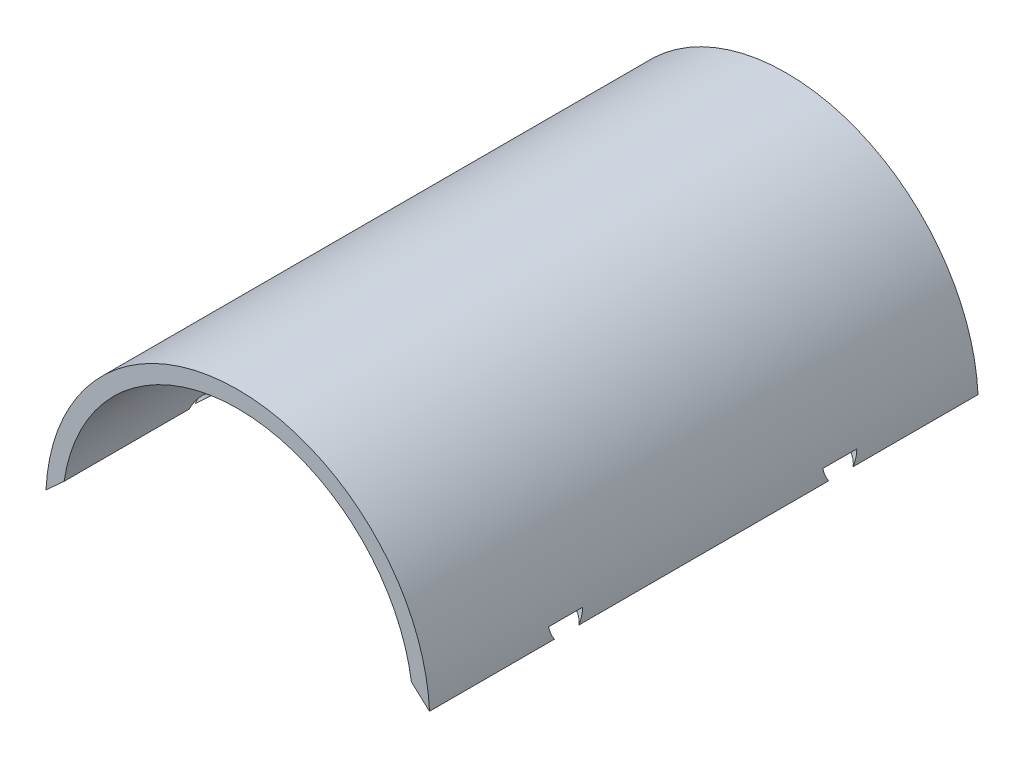
ISO-10303-21;
HEADER;
FILE_DESCRIPTION(('STEP AP214'),'2;1');
FILE_NAME('part.step','',(''),(''),'','','');
FILE_SCHEMA(('AUTOMOTIVE_DESIGN { 1 0 10303 214 1 1 1 1 }'));
ENDSEC;
DATA;
#1=APPLICATION_CONTEXT('core data for automotive mechanical design processes');
#2=APPLICATION_PROTOCOL_DEFINITION('international standard','automotive_design',2000,#1);
#3=PRODUCT_CONTEXT('',#1,'mechanical');
#4=PRODUCT('Part','Part','',(#3));
#5=PRODUCT_RELATED_PRODUCT_CATEGORY('part','',(#4));
#6=PRODUCT_DEFINITION_FORMATION('','',#4);
#7=PRODUCT_DEFINITION_CONTEXT('part definition',#1,'design');
#8=PRODUCT_DEFINITION('design','',#6,#7);
#9=PRODUCT_DEFINITION_SHAPE('','',#8);
#10=(LENGTH_UNIT() NAMED_UNIT(*) SI_UNIT(.MILLI.,.METRE.));
#11=(NAMED_UNIT(*) PLANE_ANGLE_UNIT() SI_UNIT($,.RADIAN.));
#12=(NAMED_UNIT(*) SI_UNIT($,.STERADIAN.) SOLID_ANGLE_UNIT());
#13=UNCERTAINTY_MEASURE_WITH_UNIT(LENGTH_MEASURE(1.E-05),#10,'distance_accuracy_value','');
#14=(GEOMETRIC_REPRESENTATION_CONTEXT(3) GLOBAL_UNCERTAINTY_ASSIGNED_CONTEXT((#13)) GLOBAL_UNIT_ASSIGNED_CONTEXT((#10,
#11,#12)) REPRESENTATION_CONTEXT('',''));
#15=CARTESIAN_POINT('',(0.,0.,0.));
#16=DIRECTION('',(0.,0.,1.));
#17=DIRECTION('',(1.,0.,0.));
#18=AXIS2_PLACEMENT_3D('',#15,#16,#17);
#19=CARTESIAN_POINT('',(40.2038837694651,5.93778829627168,127.));
#20=DIRECTION('',(0.672307408747507,0.740272077106257,0.));
#21=DIRECTION('',(-0.740272077106257,0.672307408747507,0.));
#22=AXIS2_PLACEMENT_3D('',#19,#20,#21);
#23=PLANE('',#22);
#24=DIRECTION('',(0.,0.,-1.));
#25=VECTOR('',#24,1.);
#26=CARTESIAN_POINT('',(40.2038837694651,5.93778829627168,127.));
#27=LINE('',#26,#25);
#28=CARTESIAN_POINT('',(40.2038837694651,5.93778829627169,92.4266801787406));
#29=VERTEX_POINT('',#28);
#30=CARTESIAN_POINT('',(40.2038837694651,5.93778829627169,34.5733198212594));
#31=VERTEX_POINT('',#30);
#32=EDGE_CURVE('E175',#29,#31,#27,.T.);
#33=ORIENTED_EDGE('',*,*,#32,.T.);
#34=CARTESIAN_POINT('',(42.3014633715025,4.03278829627168,31.75));
#35=DIRECTION('',(-0.672307408747507,-0.740272077106257,0.));
#36=DIRECTION('',(-0.740272077106257,0.672307408747507,0.));
#37=AXIS2_PLACEMENT_3D('',#34,#35,#36);
#38=CIRCLE('',#37,4.);
#39=CARTESIAN_POINT('',(44.39904297354,2.12778829627169,34.5733198212594));
#40=VERTEX_POINT('',#39);
#41=EDGE_CURVE('E157',#40,#31,#38,.T.);
#42=ORIENTED_EDGE('',*,*,#41,.F.);
#43=DIRECTION('',(0.,0.,-1.));
#44=VECTOR('',#43,1.);
#45=CARTESIAN_POINT('',(44.39904297354,2.12778829627168,127.));
#46=LINE('',#45,#44);
#47=CARTESIAN_POINT('',(44.39904297354,2.12778829627169,92.4266801787406));
#48=VERTEX_POINT('',#47);
#49=EDGE_CURVE('E180',#48,#40,#46,.T.);
#50=ORIENTED_EDGE('',*,*,#49,.F.);
#51=CARTESIAN_POINT('',(42.3014633715025,4.03278829627168,95.25));
#52=DIRECTION('',(-0.672307408747507,-0.740272077106257,0.));
#53=DIRECTION('',(0.740272077106257,-0.672307408747507,0.));
#54=AXIS2_PLACEMENT_3D('',#51,#52,#53);
#55=CIRCLE('',#54,4.);
#56=EDGE_CURVE('E162',#29,#48,#55,.T.);
#57=ORIENTED_EDGE('',*,*,#56,.F.);
#58=EDGE_LOOP('',(#33,#42,#50,#57));
#59=FACE_BOUND('',#58,.T.);
#60=ADVANCED_FACE('F34',(#59),#23,.F.);
#61=CARTESIAN_POINT('',(40.2038837694651,5.93778829627168,127.));
#62=VERTEX_POINT('',#61);
#63=CARTESIAN_POINT('',(40.2038837694651,5.93778829627169,98.0733198212594));
#64=VERTEX_POINT('',#63);
#65=EDGE_CURVE('E178',#62,#64,#27,.T.);
#66=ORIENTED_EDGE('',*,*,#65,.T.);
#67=CARTESIAN_POINT('',(44.39904297354,2.12778829627169,98.0733198212595));
#68=VERTEX_POINT('',#67);
#69=EDGE_CURVE('E240',#68,#64,#55,.T.);
#70=ORIENTED_EDGE('',*,*,#69,.F.);
#71=CARTESIAN_POINT('',(44.39904297354,2.12778829627168,127.));
#72=VERTEX_POINT('',#71);
#73=EDGE_CURVE('E176',#72,#68,#46,.T.);
#74=ORIENTED_EDGE('',*,*,#73,.F.);
#75=DIRECTION('',(0.740272077106257,-0.672307408747507,0.));
#76=VECTOR('',#75,1.);
#77=CARTESIAN_POINT('',(40.2038837694651,5.93778829627168,127.));
#78=LINE('',#77,#76);
#79=EDGE_CURVE('E305',#62,#72,#78,.T.);
#80=ORIENTED_EDGE('',*,*,#79,.F.);
#81=EDGE_LOOP('',(#66,#70,#74,#80));
#82=FACE_BOUND('',#81,.T.);
#83=ADVANCED_FACE('F353',(#82),#23,.F.);
#84=CARTESIAN_POINT('',(-40.2038837694651,5.93778829627168,127.));
#85=DIRECTION('',(-0.672307408747507,0.740272077106257,0.));
#86=DIRECTION('',(-0.740272077106257,-0.672307408747507,0.));
#87=AXIS2_PLACEMENT_3D('',#84,#85,#86);
#88=PLANE('',#87);
#89=DIRECTION('',(0.,0.,-1.));
#90=VECTOR('',#89,1.);
#91=CARTESIAN_POINT('',(-44.39904297354,2.12778829627168,127.));
#92=LINE('',#91,#90);
#93=CARTESIAN_POINT('',(-44.39904297354,2.12778829627168,92.4266801787406));
#94=VERTEX_POINT('',#93);
#95=CARTESIAN_POINT('',(-44.39904297354,2.12778829627168,34.5733198212594));
#96=VERTEX_POINT('',#95);
#97=EDGE_CURVE('E328',#94,#96,#92,.T.);
#98=ORIENTED_EDGE('',*,*,#97,.T.);
#99=CARTESIAN_POINT('',(-42.3014633715025,4.03278829627169,31.75));
#100=DIRECTION('',(-0.672307408747507,0.740272077106257,0.));
#101=DIRECTION('',(-0.740272077106257,-0.672307408747507,0.));
#102=AXIS2_PLACEMENT_3D('',#99,#100,#101);
#103=CIRCLE('',#102,4.);
#104=CARTESIAN_POINT('',(-40.2038837694651,5.93778829627168,34.5733198212594));
#105=VERTEX_POINT('',#104);
#106=EDGE_CURVE('E194',#96,#105,#103,.T.);
#107=ORIENTED_EDGE('',*,*,#106,.T.);
#108=DIRECTION('',(0.,0.,-1.));
#109=VECTOR('',#108,1.);
#110=CARTESIAN_POINT('',(-40.2038837694651,5.93778829627168,127.));
#111=LINE('',#110,#109);
#112=CARTESIAN_POINT('',(-40.2038837694651,5.93778829627168,92.4266801787406));
#113=VERTEX_POINT('',#112);
#114=EDGE_CURVE('E325',#113,#105,#111,.T.);
#115=ORIENTED_EDGE('',*,*,#114,.F.);
#116=CARTESIAN_POINT('',(-42.3014633715025,4.03278829627169,95.25));
#117=DIRECTION('',(-0.672307408747507,0.740272077106257,0.));
#118=DIRECTION('',(-0.740272077106257,-0.672307408747507,0.));
#119=AXIS2_PLACEMENT_3D('',#116,#117,#118);
#120=CIRCLE('',#119,4.);
#121=EDGE_CURVE('E184',#113,#94,#120,.T.);
#122=ORIENTED_EDGE('',*,*,#121,.T.);
#123=EDGE_LOOP('',(#98,#107,#115,#122));
#124=FACE_BOUND('',#123,.T.);
#125=ADVANCED_FACE('F359',(#124),#88,.F.);
#126=CARTESIAN_POINT('',(-44.39904297354,2.12778829627168,127.));
#127=VERTEX_POINT('',#126);
#128=CARTESIAN_POINT('',(-44.39904297354,2.12778829627168,98.0733198212594));
#129=VERTEX_POINT('',#128);
#130=EDGE_CURVE('E326',#127,#129,#92,.T.);
#131=ORIENTED_EDGE('',*,*,#130,.T.);
#132=CARTESIAN_POINT('',(-42.3014633715025,4.03278829627169,95.25));
#133=DIRECTION('',(0.672307408747507,-0.740272077106257,0.));
#134=DIRECTION('',(0.740272077106257,0.672307408747507,0.));
#135=AXIS2_PLACEMENT_3D('',#132,#133,#134);
#136=CIRCLE('',#135,4.);
#137=CARTESIAN_POINT('',(-40.2038837694651,5.93778829627168,98.0733198212595));
#138=VERTEX_POINT('',#137);
#139=EDGE_CURVE('E271',#138,#129,#136,.T.);
#140=ORIENTED_EDGE('',*,*,#139,.F.);
#141=CARTESIAN_POINT('',(-40.2038837694651,5.93778829627168,127.));
#142=VERTEX_POINT('',#141);
#143=EDGE_CURVE('E321',#142,#138,#111,.T.);
#144=ORIENTED_EDGE('',*,*,#143,.F.);
#145=DIRECTION('',(0.740272077106257,0.672307408747507,0.));
#146=VECTOR('',#145,1.);
#147=CARTESIAN_POINT('',(-40.2038837694651,5.93778829627168,127.));
#148=LINE('',#147,#146);
#149=EDGE_CURVE('E310',#127,#142,#148,.T.);
#150=ORIENTED_EDGE('',*,*,#149,.F.);
#151=EDGE_LOOP('',(#131,#140,#144,#150));
#152=FACE_BOUND('',#151,.T.);
#153=ADVANCED_FACE('F365',(#152),#88,.F.);
#154=CARTESIAN_POINT('',(0.,0.,127.));
#155=DIRECTION('',(0.,0.,-1.));
#156=DIRECTION('',(-1.,0.,0.));
#157=AXIS2_PLACEMENT_3D('',#154,#155,#156);
#158=CYLINDRICAL_SURFACE('',#157,40.64);
#159=CARTESIAN_POINT('',(40.2038837694651,5.93778829627169,28.9266801787406));
#160=VERTEX_POINT('',#159);
#161=CARTESIAN_POINT('',(40.2038837694651,5.93778829627168,0.));
#162=VERTEX_POINT('',#161);
#163=EDGE_CURVE('E168',#160,#162,#27,.T.);
#164=ORIENTED_EDGE('',*,*,#163,.F.);
#165=CARTESIAN_POINT('',(40.2038837694651,5.93778829627168,28.9266801787405));
#166=CARTESIAN_POINT('',(40.1913132421633,6.02291585990194,28.9934510123841));
#167=CARTESIAN_POINT('',(40.1788118055654,6.10567612462734,29.0633090284334));
#168=CARTESIAN_POINT('',(40.1541531544196,6.26578865022537,29.2091564919255));
#169=CARTESIAN_POINT('',(40.141996254572,6.34313605606762,29.2851513154342));
#170=CARTESIAN_POINT('',(40.1181724615959,6.49211688683357,29.4436650040298));
#171=CARTESIAN_POINT('',(40.1065096054522,6.56370640806693,29.5262259066478));
#172=CARTESIAN_POINT('',(40.084010278307,6.6997366130758,29.6971383550985));
#173=CARTESIAN_POINT('',(40.0731736749685,6.76417844241917,29.785488969387));
#174=CARTESIAN_POINT('',(40.0525137129598,6.88545967671022,29.9681581372088));
#175=CARTESIAN_POINT('',(40.0426967734591,6.94225151658455,30.0625091010737));
#176=CARTESIAN_POINT('',(40.0244097045485,7.04691787405928,30.2561039358884));
#177=CARTESIAN_POINT('',(40.0159388212325,7.09479738591595,30.3553450268524));
#178=CARTESIAN_POINT('',(40.0005991194072,7.18077811889622,30.5577622636441));
#179=CARTESIAN_POINT('',(39.9937256904317,7.2189075129172,30.6609260593821));
#180=CARTESIAN_POINT('',(39.9817585070471,7.28489638060096,30.8705846116719));
#181=CARTESIAN_POINT('',(39.9766644580635,7.31275755419962,30.9770788136948));
#182=CARTESIAN_POINT('',(39.9688951209998,7.35509542875869,31.1799319276881));
#183=CARTESIAN_POINT('',(39.9660082465001,7.3707473426962,31.276038760085));
#184=CARTESIAN_POINT('',(39.9618273423075,7.3933814191251,31.4692982070598));
#185=CARTESIAN_POINT('',(39.9605331676218,7.40036437080397,31.5664507256303));
#186=CARTESIAN_POINT('',(39.959572741404,7.40554902528819,31.7610426896164));
#187=CARTESIAN_POINT('',(39.9599071437956,7.40374720073628,31.8584822345852));
#188=CARTESIAN_POINT('',(39.9621931505267,7.39139675083091,32.0527577855384));
#189=CARTESIAN_POINT('',(39.9641446988048,7.38084842869078,32.1495938123277));
#190=CARTESIAN_POINT('',(39.9719414920248,7.33855241593987,32.4233064206819));
#191=CARTESIAN_POINT('',(39.9796837595757,7.29642130763877,32.598631266668));
#192=CARTESIAN_POINT('',(39.999871326816,7.18491731329964,32.9398936292307));
#193=CARTESIAN_POINT('',(40.0123158095611,7.11554915923651,33.1058327706885));
#194=CARTESIAN_POINT('',(40.0415424936381,6.94923599022483,33.4318167729333));
#195=CARTESIAN_POINT('',(40.0584870977926,6.85124076692094,33.5913081757797));
#196=CARTESIAN_POINT('',(40.095192960951,6.63304538763829,33.8939532611374));
#197=CARTESIAN_POINT('',(40.1149555090133,6.51283506194857,34.0370994123058));
#198=CARTESIAN_POINT('',(40.1465702815048,6.31406979300913,34.2436060183779));
#199=CARTESIAN_POINT('',(40.1578673895727,6.24187114155977,34.3133169061829));
#200=CARTESIAN_POINT('',(40.1807169493678,6.09304946759937,34.4473146031002));
#201=CARTESIAN_POINT('',(40.1922684964993,6.01644092130682,34.5116176253914));
#202=CARTESIAN_POINT('',(40.2038837694651,5.93778829627167,34.5733198212594));
#203=B_SPLINE_CURVE_WITH_KNOTS('',3,(#165,#166,#167,#168,#169,#170,#171,#172,#173,#174,#175,
#176,#177,#178,#179,#180,#181,#182,#183,#184,#185,#186,#187,#188,#189,#190,#191,#192,#193,#194,
#195,#196,#197,#198,#199,#200,#201,#202),.UNSPECIFIED.,.F.,.F.,(4,2,2,2,2,2,2,2,2,2,2,2,2,2,2,2,
2,2,4),(0.,0.326735220214413,0.653759843865192,0.98307921047324,1.31234572023099,
1.64357330309617,1.97461471142324,2.30468848457325,2.63470758840894,2.92656284759355,
3.21839153549946,3.51033741122766,3.80227316654105,4.34104349743153,4.87972026749842,
5.44137750791957,6.00329250565085,6.30606558674253,6.60789591837457),.UNSPECIFIED.);
#204=EDGE_CURVE('E152',#160,#31,#203,.T.);
#205=ORIENTED_EDGE('',*,*,#204,.T.);
#206=ORIENTED_EDGE('',*,*,#32,.F.);
#207=CARTESIAN_POINT('',(40.2038837694651,5.93778829627168,92.4266801787406));
#208=CARTESIAN_POINT('',(40.1913132421633,6.02291585990195,92.4934510123841));
#209=CARTESIAN_POINT('',(40.1788118055654,6.10567612462735,92.5633090284335));
#210=CARTESIAN_POINT('',(40.1541531544196,6.26578865022539,92.7091564919255));
#211=CARTESIAN_POINT('',(40.141996254572,6.34313605606763,92.7851513154342));
#212=CARTESIAN_POINT('',(40.1181724615959,6.49211688683358,92.9436650040298));
#213=CARTESIAN_POINT('',(40.1065096054522,6.56370640806694,93.0262259066478));
#214=CARTESIAN_POINT('',(40.084010278307,6.6997366130758,93.1971383550985));
#215=CARTESIAN_POINT('',(40.0731736749685,6.76417844241918,93.285488969387));
#216=CARTESIAN_POINT('',(40.0525137129598,6.88545967671023,93.4681581372088));
#217=CARTESIAN_POINT('',(40.0426967734591,6.94225151658456,93.5625091010737));
#218=CARTESIAN_POINT('',(40.0244097045485,7.04691787405928,93.7561039358884));
#219=CARTESIAN_POINT('',(40.0159388212325,7.09479738591595,93.8553450268524));
#220=CARTESIAN_POINT('',(40.0005991194072,7.18077811889622,94.0577622636441));
#221=CARTESIAN_POINT('',(39.9937256904317,7.2189075129172,94.1609260593821));
#222=CARTESIAN_POINT('',(39.9817585070471,7.28489638060096,94.3705846116719));
#223=CARTESIAN_POINT('',(39.9766644580635,7.31275755419961,94.4770788136948));
#224=CARTESIAN_POINT('',(39.9688951209998,7.35509542875868,94.6799319276881));
#225=CARTESIAN_POINT('',(39.9660082465001,7.3707473426962,94.776038760085));
#226=CARTESIAN_POINT('',(39.9618273423075,7.3933814191251,94.9692982070598));
#227=CARTESIAN_POINT('',(39.9605331676218,7.40036437080397,95.0664507256303));
#228=CARTESIAN_POINT('',(39.959572741404,7.40554902528819,95.2610426896164));
#229=CARTESIAN_POINT('',(39.9599071437956,7.40374720073629,95.3584822345852));
#230=CARTESIAN_POINT('',(39.9621931505267,7.39139675083091,95.5527577855384));
#231=CARTESIAN_POINT('',(39.9641446988048,7.38084842869078,95.6495938123277));
#232=CARTESIAN_POINT('',(39.9719414920248,7.33855241593987,95.9233064206819));
#233=CARTESIAN_POINT('',(39.9796837595757,7.29642130763877,96.098631266668));
#234=CARTESIAN_POINT('',(39.999871326816,7.18491731329964,96.4398936292307));
#235=CARTESIAN_POINT('',(40.0123158095611,7.11554915923651,96.6058327706885));
#236=CARTESIAN_POINT('',(40.0415424936381,6.94923599022484,96.9318167729333));
#237=CARTESIAN_POINT('',(40.0584870977926,6.85124076692094,97.0913081757797));
#238=CARTESIAN_POINT('',(40.095192960951,6.63304538763829,97.3939532611374));
#239=CARTESIAN_POINT('',(40.1149555090133,6.51283506194857,97.5370994123058));
#240=CARTESIAN_POINT('',(40.1465702815048,6.31406979300913,97.7436060183779));
#241=CARTESIAN_POINT('',(40.1578673895727,6.24187114155977,97.8133169061829));
#242=CARTESIAN_POINT('',(40.1807169493678,6.09304946759939,97.9473146031002));
#243=CARTESIAN_POINT('',(40.1922684964993,6.01644092130683,98.0116176253914));
#244=CARTESIAN_POINT('',(40.2038837694651,5.93778829627168,98.0733198212594));
#245=B_SPLINE_CURVE_WITH_KNOTS('',3,(#207,#208,#209,#210,#211,#212,#213,#214,#215,#216,#217,
#218,#219,#220,#221,#222,#223,#224,#225,#226,#227,#228,#229,#230,#231,#232,#233,#234,#235,#236,
#237,#238,#239,#240,#241,#242,#243,#244),.UNSPECIFIED.,.F.,.F.,(4,2,2,2,2,2,2,2,2,2,2,2,2,2,2,2,
2,2,4),(0.,0.326735220214428,0.6537598438652,0.983079210473251,1.312345720231,1.64357330309617,
1.97461471142322,2.30468848457322,2.63470758840893,2.92656284759352,3.21839153549944,
3.51033741122764,3.80227316654104,4.34104349743151,4.8797202674984,5.44137750791957,
6.00329250565085,6.30606558674251,6.60789591837454),.UNSPECIFIED.);
#246=EDGE_CURVE('E232',#29,#64,#245,.T.);
#247=ORIENTED_EDGE('',*,*,#246,.T.);
#248=ORIENTED_EDGE('',*,*,#65,.F.);
#249=CARTESIAN_POINT('',(0.,0.,127.));
#250=DIRECTION('',(0.,0.,-1.));
#251=DIRECTION('',(1.,0.,0.));
#252=AXIS2_PLACEMENT_3D('',#249,#250,#251);
#253=CIRCLE('',#252,40.64);
#254=EDGE_CURVE('E302',#142,#62,#253,.T.);
#255=ORIENTED_EDGE('',*,*,#254,.F.);
#256=ORIENTED_EDGE('',*,*,#143,.T.);
#257=CARTESIAN_POINT('',(-40.2038837694651,5.93778829627168,98.0733198212594));
#258=CARTESIAN_POINT('',(-40.1913132421633,6.02291585990196,98.0065489876159));
#259=CARTESIAN_POINT('',(-40.1788118055654,6.10567612462736,97.9366909715666));
#260=CARTESIAN_POINT('',(-40.1541531544196,6.26578865022539,97.7908435080745));
#261=CARTESIAN_POINT('',(-40.141996254572,6.34313605606764,97.7148486845658));
#262=CARTESIAN_POINT('',(-40.1181724615959,6.49211688683358,97.5563349959702));
#263=CARTESIAN_POINT('',(-40.1065096054522,6.56370640806695,97.4737740933522));
#264=CARTESIAN_POINT('',(-40.084010278307,6.69973661307581,97.3028616449015));
#265=CARTESIAN_POINT('',(-40.0731736749685,6.76417844241919,97.2145110306131));
#266=CARTESIAN_POINT('',(-40.0525137129598,6.88545967671023,97.0318418627912));
#267=CARTESIAN_POINT('',(-40.0426967734591,6.94225151658456,96.9374908989263));
#268=CARTESIAN_POINT('',(-40.0244097045485,7.04691787405929,96.7438960641116));
#269=CARTESIAN_POINT('',(-40.0159388212325,7.09479738591597,96.6446549731476));
#270=CARTESIAN_POINT('',(-40.0005991194072,7.18077811889623,96.4422377363558));
#271=CARTESIAN_POINT('',(-39.9937256904317,7.21890751291721,96.3390739406179));
#272=CARTESIAN_POINT('',(-39.9817585070471,7.28489638060096,96.1294153883281));
#273=CARTESIAN_POINT('',(-39.9766644580635,7.31275755419962,96.0229211863052));
#274=CARTESIAN_POINT('',(-39.9688951209998,7.35509542875869,95.8200680723119));
#275=CARTESIAN_POINT('',(-39.9660082465001,7.3707473426962,95.723961239915));
#276=CARTESIAN_POINT('',(-39.9618273423075,7.39338141912511,95.5307017929402));
#277=CARTESIAN_POINT('',(-39.9605331676218,7.40036437080398,95.4335492743697));
#278=CARTESIAN_POINT('',(-39.959572741404,7.4055490252882,95.2389573103836));
#279=CARTESIAN_POINT('',(-39.9599071437956,7.40374720073629,95.1415177654148));
#280=CARTESIAN_POINT('',(-39.9621931505267,7.39139675083092,94.9472422144616));
#281=CARTESIAN_POINT('',(-39.9641446988048,7.38084842869079,94.8504061876723));
#282=CARTESIAN_POINT('',(-39.9719414920248,7.33855241593987,94.5766935793181));
#283=CARTESIAN_POINT('',(-39.9796837595757,7.29642130763877,94.401368733332));
#284=CARTESIAN_POINT('',(-39.999871326816,7.18491731329965,94.0601063707693));
#285=CARTESIAN_POINT('',(-40.0123158095611,7.11554915923653,93.8941672293115));
#286=CARTESIAN_POINT('',(-40.0415424936381,6.94923599022485,93.5681832270667));
#287=CARTESIAN_POINT('',(-40.0584870977926,6.85124076692096,93.4086918242203));
#288=CARTESIAN_POINT('',(-40.095192960951,6.63304538763831,93.1060467388627));
#289=CARTESIAN_POINT('',(-40.1149555090133,6.51283506194859,92.9629005876942));
#290=CARTESIAN_POINT('',(-40.1465702815048,6.31406979300914,92.7563939816221));
#291=CARTESIAN_POINT('',(-40.1578673895727,6.24187114155978,92.6866830938171));
#292=CARTESIAN_POINT('',(-40.1807169493678,6.09304946759939,92.5526853968998));
#293=CARTESIAN_POINT('',(-40.1922684964993,6.01644092130683,92.4883823746086));
#294=CARTESIAN_POINT('',(-40.2038837694651,5.93778829627169,92.4266801787406));
#295=B_SPLINE_CURVE_WITH_KNOTS('',3,(#257,#258,#259,#260,#261,#262,#263,#264,#265,#266,#267,
#268,#269,#270,#271,#272,#273,#274,#275,#276,#277,#278,#279,#280,#281,#282,#283,#284,#285,#286,
#287,#288,#289,#290,#291,#292,#293,#294),.UNSPECIFIED.,.F.,.F.,(4,2,2,2,2,2,2,2,2,2,2,2,2,2,2,2,
2,2,4),(0.,0.326735220214419,0.6537598438652,0.983079210473239,1.31234572023098,
1.64357330309617,1.97461471142325,2.30468848457322,2.63470758840893,2.9265628475935,
3.21839153549944,3.51033741122763,3.80227316654104,4.34104349743151,4.87972026749839,
5.44137750791955,6.00329250565083,6.30606558674251,6.60789591837454),.UNSPECIFIED.);
#296=EDGE_CURVE('E296',#138,#113,#295,.T.);
#297=ORIENTED_EDGE('',*,*,#296,.T.);
#298=ORIENTED_EDGE('',*,*,#114,.T.);
#299=CARTESIAN_POINT('',(-40.2038837694651,5.93778829627168,34.5733198212594));
#300=CARTESIAN_POINT('',(-40.1913132421633,6.02291585990195,34.5065489876159));
#301=CARTESIAN_POINT('',(-40.1788118055654,6.10567612462735,34.4366909715666));
#302=CARTESIAN_POINT('',(-40.1541531544196,6.26578865022539,34.2908435080745));
#303=CARTESIAN_POINT('',(-40.141996254572,6.34313605606763,34.2148486845658));
#304=CARTESIAN_POINT('',(-40.1181724615959,6.49211688683358,34.0563349959702));
#305=CARTESIAN_POINT('',(-40.1065096054522,6.56370640806695,33.9737740933522));
#306=CARTESIAN_POINT('',(-40.084010278307,6.69973661307581,33.8028616449015));
#307=CARTESIAN_POINT('',(-40.0731736749685,6.76417844241919,33.714511030613));
#308=CARTESIAN_POINT('',(-40.0525137129598,6.88545967671023,33.5318418627912));
#309=CARTESIAN_POINT('',(-40.0426967734591,6.94225151658456,33.4374908989263));
#310=CARTESIAN_POINT('',(-40.0244097045485,7.04691787405929,33.2438960641116));
#311=CARTESIAN_POINT('',(-40.0159388212325,7.09479738591597,33.1446549731476));
#312=CARTESIAN_POINT('',(-40.0005991194072,7.18077811889623,32.9422377363558));
#313=CARTESIAN_POINT('',(-39.9937256904317,7.21890751291721,32.8390739406179));
#314=CARTESIAN_POINT('',(-39.9817585070471,7.28489638060096,32.6294153883281));
#315=CARTESIAN_POINT('',(-39.9766644580635,7.31275755419962,32.5229211863052));
#316=CARTESIAN_POINT('',(-39.9688951209998,7.35509542875869,32.3200680723118));
#317=CARTESIAN_POINT('',(-39.9660082465001,7.37074734269621,32.223961239915));
#318=CARTESIAN_POINT('',(-39.9618273423075,7.39338141912511,32.0307017929402));
#319=CARTESIAN_POINT('',(-39.9605331676218,7.40036437080398,31.9335492743697));
#320=CARTESIAN_POINT('',(-39.959572741404,7.4055490252882,31.7389573103836));
#321=CARTESIAN_POINT('',(-39.9599071437956,7.40374720073629,31.6415177654148));
#322=CARTESIAN_POINT('',(-39.9621931505267,7.39139675083092,31.4472422144616));
#323=CARTESIAN_POINT('',(-39.9641446988048,7.38084842869078,31.3504061876723));
#324=CARTESIAN_POINT('',(-39.9719414920248,7.33855241593987,31.0766935793181));
#325=CARTESIAN_POINT('',(-39.9796837595757,7.29642130763878,30.901368733332));
#326=CARTESIAN_POINT('',(-39.999871326816,7.18491731329965,30.5601063707693));
#327=CARTESIAN_POINT('',(-40.0123158095611,7.11554915923652,30.3941672293115));
#328=CARTESIAN_POINT('',(-40.0415424936381,6.94923599022484,30.0681832270667));
#329=CARTESIAN_POINT('',(-40.0584870977926,6.85124076692095,29.9086918242203));
#330=CARTESIAN_POINT('',(-40.095192960951,6.6330453876383,29.6060467388626));
#331=CARTESIAN_POINT('',(-40.1149555090133,6.51283506194858,29.4629005876942));
#332=CARTESIAN_POINT('',(-40.1465702815048,6.31406979300913,29.2563939816221));
#333=CARTESIAN_POINT('',(-40.1578673895727,6.24187114155977,29.1866830938171));
#334=CARTESIAN_POINT('',(-40.1807169493678,6.09304946759938,29.0526853968998));
#335=CARTESIAN_POINT('',(-40.1922684964993,6.01644092130683,28.9883823746086));
#336=CARTESIAN_POINT('',(-40.2038837694651,5.93778829627168,28.9266801787406));
#337=B_SPLINE_CURVE_WITH_KNOTS('',3,(#299,#300,#301,#302,#303,#304,#305,#306,#307,#308,#309,
#310,#311,#312,#313,#314,#315,#316,#317,#318,#319,#320,#321,#322,#323,#324,#325,#326,#327,#328,
#329,#330,#331,#332,#333,#334,#335,#336),.UNSPECIFIED.,.F.,.F.,(4,2,2,2,2,2,2,2,2,2,2,2,2,2,2,2,
2,2,4),(0.,0.326735220214417,0.653759843865196,0.983079210473245,1.31234572023099,
1.64357330309618,1.97461471142326,2.30468848457325,2.63470758840894,2.92656284759354,
3.21839153549946,3.51033741122766,3.80227316654105,4.34104349743152,4.87972026749841,
5.44137750791957,6.00329250565085,6.30606558674253,6.60789591837456),.UNSPECIFIED.);
#338=CARTESIAN_POINT('',(-40.2038837694651,5.93778829627168,28.9266801787406));
#339=VERTEX_POINT('',#338);
#340=EDGE_CURVE('E265',#105,#339,#337,.T.);
#341=ORIENTED_EDGE('',*,*,#340,.T.);
#342=CARTESIAN_POINT('',(-40.2038837694651,5.93778829627168,0.));
#343=VERTEX_POINT('',#342);
#344=EDGE_CURVE('E312',#339,#343,#111,.T.);
#345=ORIENTED_EDGE('',*,*,#344,.T.);
#346=CARTESIAN_POINT('',(0.,0.,0.));
#347=DIRECTION('',(0.,0.,-1.));
#348=DIRECTION('',(1.,0.,0.));
#349=AXIS2_PLACEMENT_3D('',#346,#347,#348);
#350=CIRCLE('',#349,40.64);
#351=EDGE_CURVE('E174',#343,#162,#350,.T.);
#352=ORIENTED_EDGE('',*,*,#351,.T.);
#353=EDGE_LOOP('',(#164,#205,#206,#247,#248,#255,#256,#297,#298,#341,#345,#352));
#354=FACE_BOUND('',#353,.T.);
#355=ADVANCED_FACE('F36',(#354),#158,.F.);
#356=CARTESIAN_POINT('',(44.39904297354,2.12778829627169,28.9266801787406));
#357=VERTEX_POINT('',#356);
#358=CARTESIAN_POINT('',(44.39904297354,2.12778829627168,0.));
#359=VERTEX_POINT('',#358);
#360=EDGE_CURVE('E170',#357,#359,#46,.T.);
#361=ORIENTED_EDGE('',*,*,#360,.F.);
#362=EDGE_CURVE('E155',#160,#357,#38,.T.);
#363=ORIENTED_EDGE('',*,*,#362,.F.);
#364=ORIENTED_EDGE('',*,*,#163,.T.);
#365=DIRECTION('',(0.740272077106257,-0.672307408747507,0.));
#366=VECTOR('',#365,1.);
#367=CARTESIAN_POINT('',(40.2038837694651,5.93778829627168,0.));
#368=LINE('',#367,#366);
#369=EDGE_CURVE('E314',#162,#359,#368,.T.);
#370=ORIENTED_EDGE('',*,*,#369,.T.);
#371=EDGE_LOOP('',(#361,#363,#364,#370));
#372=FACE_BOUND('',#371,.T.);
#373=ADVANCED_FACE('F166',(#372),#23,.F.);
#374=CARTESIAN_POINT('',(0.,0.,127.));
#375=DIRECTION('',(0.,0.,-1.));
#376=DIRECTION('',(-1.,0.,0.));
#377=AXIS2_PLACEMENT_3D('',#374,#375,#376);
#378=CYLINDRICAL_SURFACE('',#377,44.45);
#379=DIRECTION('',(0.,0.,-1.));
#380=VECTOR('',#379,1.);
#381=CARTESIAN_POINT('',(44.1628902552898,5.0439691017319,127.));
#382=LINE('',#381,#380);
#383=CARTESIAN_POINT('',(44.1628902552898,5.0439691017319,35.6886042369071));
#384=VERTEX_POINT('',#383);
#385=CARTESIAN_POINT('',(44.1628902552898,5.0439691017319,27.8113957630929));
#386=VERTEX_POINT('',#385);
#387=EDGE_CURVE('E502',#384,#386,#382,.T.);
#388=ORIENTED_EDGE('',*,*,#387,.T.);
#389=CARTESIAN_POINT('',(44.1628902552898,5.0439691017319,27.8113957630929));
#390=CARTESIAN_POINT('',(44.1820882207202,4.87594230518134,27.8339589502951));
#391=CARTESIAN_POINT('',(44.2002218425883,4.70860522803788,27.862614336531));
#392=CARTESIAN_POINT('',(44.2343731536034,4.37612964124249,27.9320658009129));
#393=CARTESIAN_POINT('',(44.2503893669069,4.21099273646199,27.972870283281));
#394=CARTESIAN_POINT('',(44.2800115624876,3.8870390773206,28.0656662679598));
#395=CARTESIAN_POINT('',(44.2936571173332,3.7281618752831,28.1174335879432));
#396=CARTESIAN_POINT('',(44.3189313479414,3.41460828009222,28.2326300748707));
#397=CARTESIAN_POINT('',(44.330560895291,3.25993009608055,28.2960541776434));
#398=CARTESIAN_POINT('',(44.3531677738895,2.93737590671438,28.4431843089747));
#399=CARTESIAN_POINT('',(44.363895738379,2.77016886967959,28.5284161147886));
#400=CARTESIAN_POINT('',(44.3783028882209,2.52498528170085,28.6682161995369));
#401=CARTESIAN_POINT('',(44.3828439396484,2.44378091214642,28.7170991618398));
#402=CARTESIAN_POINT('',(44.3913614431513,2.28384625817868,28.8188688486936));
#403=CARTESIAN_POINT('',(44.3953376652043,2.20511699183728,28.8717571910389));
#404=CARTESIAN_POINT('',(44.39904297354,2.12778829627168,28.9266801787406));
#405=B_SPLINE_CURVE_WITH_KNOTS('',3,(#389,#390,#391,#392,#393,#394,#395,#396,#397,#398,#399,
#400,#401,#402,#403,#404),.UNSPECIFIED.,.F.,.F.,(4,2,2,2,2,2,2,4),(0.,0.511752184475264,
1.0238592028553,1.52636097799274,2.02864496014022,2.59173143963583,2.87630157654166,
3.16098727221965),.UNSPECIFIED.);
#406=EDGE_CURVE('E11',#386,#357,#405,.T.);
#407=ORIENTED_EDGE('',*,*,#406,.T.);
#408=ORIENTED_EDGE('',*,*,#360,.T.);
#409=CARTESIAN_POINT('',(0.,0.,0.));
#410=DIRECTION('',(0.,0.,1.));
#411=DIRECTION('',(1.,0.,0.));
#412=AXIS2_PLACEMENT_3D('',#409,#410,#411);
#413=CIRCLE('',#412,44.45);
#414=CARTESIAN_POINT('',(-44.39904297354,2.12778829627168,0.));
#415=VERTEX_POINT('',#414);
#416=EDGE_CURVE('E316',#359,#415,#413,.T.);
#417=ORIENTED_EDGE('',*,*,#416,.T.);
#418=CARTESIAN_POINT('',(-44.39904297354,2.12778829627168,28.9266801787406));
#419=VERTEX_POINT('',#418);
#420=EDGE_CURVE('E324',#419,#415,#92,.T.);
#421=ORIENTED_EDGE('',*,*,#420,.F.);
#422=CARTESIAN_POINT('',(-44.39904297354,2.12778829627169,28.9266801787406));
#423=CARTESIAN_POINT('',(-44.3923544121857,2.26755422855096,28.8274648839044));
#424=CARTESIAN_POINT('',(-44.3847697444573,2.41182904743819,28.7348491723727));
#425=CARTESIAN_POINT('',(-44.3676992322139,2.70766808373903,28.5625195523055));
#426=CARTESIAN_POINT('',(-44.3582146804163,2.85922729170751,28.4827969373645));
#427=CARTESIAN_POINT('',(-44.3374132457908,3.16535500446613,28.3371290720843));
#428=CARTESIAN_POINT('',(-44.3261319375629,3.31982210178386,28.2709640758075));
#429=CARTESIAN_POINT('',(-44.3015526560469,3.63312860846836,28.1504645585049));
#430=CARTESIAN_POINT('',(-44.2882547656636,3.79196783787064,28.096129551354));
#431=CARTESIAN_POINT('',(-44.258059245395,4.13018844143037,27.993989540617));
#432=CARTESIAN_POINT('',(-44.2409286505058,4.30994855252609,27.947506303486));
#433=CARTESIAN_POINT('',(-44.2039449863492,4.67416719068072,27.8685821480094));
#434=CARTESIAN_POINT('',(-44.184066246256,4.85865479889099,27.8362873030421));
#435=CARTESIAN_POINT('',(-44.1628902552898,5.0439691017319,27.8113957630929));
#436=B_SPLINE_CURVE_WITH_KNOTS('',3,(#422,#423,#424,#425,#426,#427,#428,#429,#430,#431,#432,
#433,#434,#435),.UNSPECIFIED.,.F.,.F.,(4,2,2,2,2,2,4),(0.,0.514248289297657,1.02814785559117,
1.53291089918042,2.03765319683236,2.59643000698799,3.16083196864484),.UNSPECIFIED.);
#437=CARTESIAN_POINT('',(-44.1628902552898,5.0439691017319,27.8113957630929));
#438=VERTEX_POINT('',#437);
#439=EDGE_CURVE('E245',#419,#438,#436,.T.);
#440=ORIENTED_EDGE('',*,*,#439,.T.);
#441=DIRECTION('',(0.,0.,-1.));
#442=VECTOR('',#441,1.);
#443=CARTESIAN_POINT('',(-44.1628902552898,5.0439691017319,127.));
#444=LINE('',#443,#442);
#445=CARTESIAN_POINT('',(-44.1628902552898,5.0439691017319,35.6886042369071));
#446=VERTEX_POINT('',#445);
#447=EDGE_CURVE('E199',#438,#446,#444,.F.);
#448=ORIENTED_EDGE('',*,*,#447,.T.);
#449=CARTESIAN_POINT('',(-44.1628902552898,5.0439691017319,35.6886042369071));
#450=CARTESIAN_POINT('',(-44.1820882207202,4.87594230518134,35.6660410497049));
#451=CARTESIAN_POINT('',(-44.2002218425883,4.70860522803788,35.637385663469));
#452=CARTESIAN_POINT('',(-44.2343731536034,4.37612964124249,35.5679341990871));
#453=CARTESIAN_POINT('',(-44.2503893669069,4.21099273646199,35.527129716719));
#454=CARTESIAN_POINT('',(-44.2800115624876,3.8870390773206,35.4343337320402));
#455=CARTESIAN_POINT('',(-44.2936571173332,3.7281618752831,35.3825664120567));
#456=CARTESIAN_POINT('',(-44.3189313479414,3.41460828009222,35.2673699251293));
#457=CARTESIAN_POINT('',(-44.330560895291,3.25993009608055,35.2039458223566));
#458=CARTESIAN_POINT('',(-44.3531677738895,2.93737590671438,35.0568156910253));
#459=CARTESIAN_POINT('',(-44.363895738379,2.77016886967959,34.9715838852114));
#460=CARTESIAN_POINT('',(-44.3783028882209,2.52498528170085,34.8317838004631));
#461=CARTESIAN_POINT('',(-44.3828439396484,2.44378091214643,34.7829008381602));
#462=CARTESIAN_POINT('',(-44.3913614431513,2.28384625817869,34.6811311513064));
#463=CARTESIAN_POINT('',(-44.3953376652043,2.20511699183729,34.6282428089611));
#464=CARTESIAN_POINT('',(-44.39904297354,2.12778829627169,34.5733198212594));
#465=B_SPLINE_CURVE_WITH_KNOTS('',3,(#449,#450,#451,#452,#453,#454,#455,#456,#457,#458,#459,
#460,#461,#462,#463,#464),.UNSPECIFIED.,.F.,.F.,(4,2,2,2,2,2,2,4),(0.,0.511752184475261,
1.02385920285529,1.52636097799274,2.02864496014022,2.59173143963582,2.87630157654165,
3.16098727221963),.UNSPECIFIED.);
#466=EDGE_CURVE('E252',#446,#96,#465,.T.);
#467=ORIENTED_EDGE('',*,*,#466,.T.);
#468=ORIENTED_EDGE('',*,*,#97,.F.);
#469=CARTESIAN_POINT('',(-44.39904297354,2.12778829627169,92.4266801787406));
#470=CARTESIAN_POINT('',(-44.3923544121857,2.26755422855095,92.3274648839044));
#471=CARTESIAN_POINT('',(-44.3847697444573,2.41182904743819,92.2348491723727));
#472=CARTESIAN_POINT('',(-44.3676992322139,2.70766808373903,92.0625195523055));
#473=CARTESIAN_POINT('',(-44.3582146804163,2.85922729170751,91.9827969373645));
#474=CARTESIAN_POINT('',(-44.3374132457908,3.16535500446613,91.8371290720843));
#475=CARTESIAN_POINT('',(-44.3261319375629,3.31982210178386,91.7709640758075));
#476=CARTESIAN_POINT('',(-44.3015526560469,3.63312860846835,91.6504645585049));
#477=CARTESIAN_POINT('',(-44.2882547656636,3.79196783787063,91.596129551354));
#478=CARTESIAN_POINT('',(-44.258059245395,4.13018844143037,91.493989540617));
#479=CARTESIAN_POINT('',(-44.2409286505058,4.30994855252608,91.447506303486));
#480=CARTESIAN_POINT('',(-44.2039449863492,4.67416719068071,91.3685821480094));
#481=CARTESIAN_POINT('',(-44.1840662462561,4.85865479889099,91.3362873030421));
#482=CARTESIAN_POINT('',(-44.1628902552898,5.0439691017319,91.3113957630929));
#483=B_SPLINE_CURVE_WITH_KNOTS('',3,(#469,#470,#471,#472,#473,#474,#475,#476,#477,#478,#479,
#480,#481,#482),.UNSPECIFIED.,.F.,.F.,(4,2,2,2,2,2,4),(0.,0.514248289297655,1.02814785559117,
1.53291089918042,2.03765319683236,2.59643000698798,3.16083196864484),.UNSPECIFIED.);
#484=CARTESIAN_POINT('',(-44.1628902552898,5.0439691017319,91.3113957630929));
#485=VERTEX_POINT('',#484);
#486=EDGE_CURVE('E275',#94,#485,#483,.T.);
#487=ORIENTED_EDGE('',*,*,#486,.T.);
#488=DIRECTION('',(0.,0.,-1.));
#489=VECTOR('',#488,1.);
#490=CARTESIAN_POINT('',(-44.1628902552898,5.0439691017319,127.));
#491=LINE('',#490,#489);
#492=CARTESIAN_POINT('',(-44.1628902552898,5.0439691017319,99.1886042369071));
#493=VERTEX_POINT('',#492);
#494=EDGE_CURVE('E189',#493,#485,#491,.T.);
#495=ORIENTED_EDGE('',*,*,#494,.F.);
#496=CARTESIAN_POINT('',(-44.1628902552898,5.0439691017319,99.1886042369071));
#497=CARTESIAN_POINT('',(-44.1820882207202,4.87594230518133,99.1660410497049));
#498=CARTESIAN_POINT('',(-44.2002218425883,4.70860522803788,99.137385663469));
#499=CARTESIAN_POINT('',(-44.2343731536034,4.37612964124249,99.0679341990871));
#500=CARTESIAN_POINT('',(-44.2503893669069,4.21099273646199,99.027129716719));
#501=CARTESIAN_POINT('',(-44.2800115624876,3.8870390773206,98.9343337320402));
#502=CARTESIAN_POINT('',(-44.2936571173332,3.7281618752831,98.8825664120568));
#503=CARTESIAN_POINT('',(-44.3189313479414,3.41460828009222,98.7673699251293));
#504=CARTESIAN_POINT('',(-44.330560895291,3.25993009608055,98.7039458223566));
#505=CARTESIAN_POINT('',(-44.3531677738895,2.93737590671438,98.5568156910253));
#506=CARTESIAN_POINT('',(-44.363895738379,2.77016886967959,98.4715838852114));
#507=CARTESIAN_POINT('',(-44.3783028882209,2.52498528170085,98.3317838004631));
#508=CARTESIAN_POINT('',(-44.3828439396484,2.44378091214642,98.2829008381602));
#509=CARTESIAN_POINT('',(-44.3913614431513,2.28384625817869,98.1811311513064));
#510=CARTESIAN_POINT('',(-44.3953376652043,2.20511699183729,98.1282428089611));
#511=CARTESIAN_POINT('',(-44.39904297354,2.12778829627169,98.0733198212594));
#512=B_SPLINE_CURVE_WITH_KNOTS('',3,(#496,#497,#498,#499,#500,#501,#502,#503,#504,#505,#506,
#507,#508,#509,#510,#511),.UNSPECIFIED.,.F.,.F.,(4,2,2,2,2,2,2,4),(0.,0.511752184475262,
1.02385920285529,1.52636097799274,2.02864496014022,2.59173143963583,2.87630157654165,
3.16098727221964),.UNSPECIFIED.);
#513=EDGE_CURVE('E282',#493,#129,#512,.T.);
#514=ORIENTED_EDGE('',*,*,#513,.T.);
#515=ORIENTED_EDGE('',*,*,#130,.F.);
#516=CARTESIAN_POINT('',(0.,0.,127.));
#517=DIRECTION('',(0.,0.,1.));
#518=DIRECTION('',(1.,0.,0.));
#519=AXIS2_PLACEMENT_3D('',#516,#517,#518);
#520=CIRCLE('',#519,44.45);
#521=EDGE_CURVE('E308',#72,#127,#520,.T.);
#522=ORIENTED_EDGE('',*,*,#521,.F.);
#523=ORIENTED_EDGE('',*,*,#73,.T.);
#524=CARTESIAN_POINT('',(44.39904297354,2.12778829627168,98.0733198212595));
#525=CARTESIAN_POINT('',(44.3923544121857,2.26755422855096,98.1725351160956));
#526=CARTESIAN_POINT('',(44.3847697444573,2.4118290474382,98.2651508276273));
#527=CARTESIAN_POINT('',(44.3676992322139,2.70766808373904,98.4374804476946));
#528=CARTESIAN_POINT('',(44.3582146804163,2.85922729170752,98.5172030626355));
#529=CARTESIAN_POINT('',(44.3374132457908,3.16535500446613,98.6628709279158));
#530=CARTESIAN_POINT('',(44.3261319375629,3.31982210178387,98.7290359241925));
#531=CARTESIAN_POINT('',(44.3015526560469,3.63312860846836,98.8495354414951));
#532=CARTESIAN_POINT('',(44.2882547656636,3.79196783787064,98.903870448646));
#533=CARTESIAN_POINT('',(44.258059245395,4.13018844143037,99.006010459383));
#534=CARTESIAN_POINT('',(44.2409286505058,4.30994855252609,99.0524936965141));
#535=CARTESIAN_POINT('',(44.2039449863492,4.67416719068072,99.1314178519906));
#536=CARTESIAN_POINT('',(44.184066246256,4.85865479889099,99.1637126969579));
#537=CARTESIAN_POINT('',(44.1628902552898,5.0439691017319,99.1886042369071));
#538=B_SPLINE_CURVE_WITH_KNOTS('',3,(#524,#525,#526,#527,#528,#529,#530,#531,#532,#533,#534,
#535,#536,#537),.UNSPECIFIED.,.F.,.F.,(4,2,2,2,2,2,4),(0.,0.514248289297666,1.02814785559118,
1.53291089918042,2.03765319683236,2.59643000698799,3.16083196864484),.UNSPECIFIED.);
#539=CARTESIAN_POINT('',(44.1628902552898,5.0439691017319,99.1886042369071));
#540=VERTEX_POINT('',#539);
#541=EDGE_CURVE('E211',#68,#540,#538,.T.);
#542=ORIENTED_EDGE('',*,*,#541,.T.);
#543=DIRECTION('',(0.,0.,-1.));
#544=VECTOR('',#543,1.);
#545=CARTESIAN_POINT('',(44.1628902552898,5.0439691017319,127.));
#546=LINE('',#545,#544);
#547=CARTESIAN_POINT('',(44.1628902552898,5.0439691017319,91.3113957630929));
#548=VERTEX_POINT('',#547);
#549=EDGE_CURVE('E202',#548,#540,#546,.F.);
#550=ORIENTED_EDGE('',*,*,#549,.F.);
#551=CARTESIAN_POINT('',(44.1628902552898,5.0439691017319,91.3113957630929));
#552=CARTESIAN_POINT('',(44.1820882207202,4.87594230518134,91.3339589502951));
#553=CARTESIAN_POINT('',(44.2002218425883,4.70860522803788,91.362614336531));
#554=CARTESIAN_POINT('',(44.2343731536034,4.37612964124249,91.4320658009129));
#555=CARTESIAN_POINT('',(44.2503893669069,4.21099273646199,91.472870283281));
#556=CARTESIAN_POINT('',(44.2800115624876,3.8870390773206,91.5656662679598));
#557=CARTESIAN_POINT('',(44.2936571173332,3.7281618752831,91.6174335879433));
#558=CARTESIAN_POINT('',(44.3189313479414,3.41460828009222,91.7326300748707));
#559=CARTESIAN_POINT('',(44.330560895291,3.25993009608056,91.7960541776434));
#560=CARTESIAN_POINT('',(44.3531677738895,2.93737590671438,91.9431843089747));
#561=CARTESIAN_POINT('',(44.363895738379,2.77016886967959,92.0284161147886));
#562=CARTESIAN_POINT('',(44.3783028882209,2.52498528170085,92.1682161995369));
#563=CARTESIAN_POINT('',(44.3828439396484,2.44378091214643,92.2170991618397));
#564=CARTESIAN_POINT('',(44.3913614431513,2.28384625817869,92.3188688486936));
#565=CARTESIAN_POINT('',(44.3953376652043,2.2051169918373,92.3717571910389));
#566=CARTESIAN_POINT('',(44.39904297354,2.12778829627169,92.4266801787406));
#567=B_SPLINE_CURVE_WITH_KNOTS('',3,(#551,#552,#553,#554,#555,#556,#557,#558,#559,#560,#561,
#562,#563,#564,#565,#566),.UNSPECIFIED.,.F.,.F.,(4,2,2,2,2,2,2,4),(0.,0.511752184475266,
1.0238592028553,1.52636097799274,2.02864496014022,2.59173143963582,2.87630157654164,
3.16098727221963),.UNSPECIFIED.);
#568=EDGE_CURVE('E204',#548,#48,#567,.T.);
#569=ORIENTED_EDGE('',*,*,#568,.T.);
#570=ORIENTED_EDGE('',*,*,#49,.T.);
#571=CARTESIAN_POINT('',(44.39904297354,2.12778829627168,34.5733198212594));
#572=CARTESIAN_POINT('',(44.3923544121857,2.26755422855095,34.6725351160956));
#573=CARTESIAN_POINT('',(44.3847697444573,2.41182904743819,34.7651508276273));
#574=CARTESIAN_POINT('',(44.3676992322139,2.70766808373903,34.9374804476945));
#575=CARTESIAN_POINT('',(44.3582146804163,2.85922729170751,35.0172030626355));
#576=CARTESIAN_POINT('',(44.3374132457908,3.16535500446612,35.1628709279158));
#577=CARTESIAN_POINT('',(44.3261319375629,3.31982210178386,35.2290359241925));
#578=CARTESIAN_POINT('',(44.3015526560469,3.63312860846835,35.3495354414951));
#579=CARTESIAN_POINT('',(44.2882547656636,3.79196783787063,35.403870448646));
#580=CARTESIAN_POINT('',(44.258059245395,4.13018844143036,35.506010459383));
#581=CARTESIAN_POINT('',(44.2409286505058,4.30994855252608,35.552493696514));
#582=CARTESIAN_POINT('',(44.2039449863492,4.67416719068071,35.6314178519906));
#583=CARTESIAN_POINT('',(44.184066246256,4.85865479889099,35.6637126969579));
#584=CARTESIAN_POINT('',(44.1628902552898,5.0439691017319,35.6886042369071));
#585=B_SPLINE_CURVE_WITH_KNOTS('',3,(#571,#572,#573,#574,#575,#576,#577,#578,#579,#580,#581,
#582,#583,#584),.UNSPECIFIED.,.F.,.F.,(4,2,2,2,2,2,4),(0.,0.514248289297654,1.02814785559117,
1.53291089918042,2.03765319683236,2.59643000698799,3.16083196864485),.UNSPECIFIED.);
#586=EDGE_CURVE('E48',#40,#384,#585,.T.);
#587=ORIENTED_EDGE('',*,*,#586,.T.);
#588=EDGE_LOOP('',(#388,#407,#408,#417,#421,#440,#448,#467,#468,#487,#495,#514,#515,#522,#523,
#542,#550,#569,#570,#587));
#589=FACE_BOUND('',#588,.T.);
#590=ADVANCED_FACE('F216',(#589),#378,.T.);
#591=ORIENTED_EDGE('',*,*,#344,.F.);
#592=CARTESIAN_POINT('',(-42.3014633715025,4.03278829627169,31.75));
#593=DIRECTION('',(0.672307408747507,-0.740272077106257,0.));
#594=DIRECTION('',(-0.740272077106257,-0.672307408747507,0.));
#595=AXIS2_PLACEMENT_3D('',#592,#593,#594);
#596=CIRCLE('',#595,4.);
#597=EDGE_CURVE('E239',#419,#339,#596,.T.);
#598=ORIENTED_EDGE('',*,*,#597,.F.);
#599=ORIENTED_EDGE('',*,*,#420,.T.);
#600=DIRECTION('',(0.740272077106257,0.672307408747507,0.));
#601=VECTOR('',#600,1.);
#602=CARTESIAN_POINT('',(-40.2038837694651,5.93778829627168,0.));
#603=LINE('',#602,#601);
#604=EDGE_CURVE('E306',#415,#343,#603,.T.);
#605=ORIENTED_EDGE('',*,*,#604,.T.);
#606=EDGE_LOOP('',(#591,#598,#599,#605));
#607=FACE_BOUND('',#606,.T.);
#608=ADVANCED_FACE('F337',(#607),#88,.F.);
#609=CARTESIAN_POINT('',(0.,0.,127.));
#610=DIRECTION('',(0.,0.,1.));
#611=DIRECTION('',(1.,0.,0.));
#612=AXIS2_PLACEMENT_3D('',#609,#610,#611);
#613=PLANE('',#612);
#614=ORIENTED_EDGE('',*,*,#254,.T.);
#615=ORIENTED_EDGE('',*,*,#79,.T.);
#616=ORIENTED_EDGE('',*,*,#521,.T.);
#617=ORIENTED_EDGE('',*,*,#149,.T.);
#618=EDGE_LOOP('',(#614,#615,#616,#617));
#619=FACE_BOUND('',#618,.T.);
#620=ADVANCED_FACE('F292',(#619),#613,.T.);
#621=CARTESIAN_POINT('',(0.,0.,0.));
#622=DIRECTION('',(0.,0.,1.));
#623=DIRECTION('',(1.,0.,0.));
#624=AXIS2_PLACEMENT_3D('',#621,#622,#623);
#625=PLANE('',#624);
#626=ORIENTED_EDGE('',*,*,#351,.F.);
#627=ORIENTED_EDGE('',*,*,#604,.F.);
#628=ORIENTED_EDGE('',*,*,#416,.F.);
#629=ORIENTED_EDGE('',*,*,#369,.F.);
#630=EDGE_LOOP('',(#626,#627,#628,#629));
#631=FACE_BOUND('',#630,.T.);
#632=ADVANCED_FACE('F343',(#631),#625,.F.);
#633=CARTESIAN_POINT('',(-43.6460781889975,5.5133324504842,95.25));
#634=DIRECTION('',(0.672307408747507,-0.740272077106257,0.));
#635=DIRECTION('',(0.740272077106257,0.672307408747507,0.));
#636=AXIS2_PLACEMENT_3D('',#633,#634,#635);
#637=PLANE('',#636);
#638=ORIENTED_EDGE('',*,*,#494,.T.);
#639=CARTESIAN_POINT('',(-43.6460781889975,5.5133324504842,95.25));
#640=DIRECTION('',(0.672307408747507,-0.740272077106257,0.));
#641=DIRECTION('',(0.740272077106257,0.672307408747507,0.));
#642=AXIS2_PLACEMENT_3D('',#639,#640,#641);
#643=CIRCLE('',#642,4.);
#644=EDGE_CURVE('E272',#485,#493,#643,.T.);
#645=ORIENTED_EDGE('',*,*,#644,.T.);
#646=EDGE_LOOP('',(#638,#645));
#647=FACE_BOUND('',#646,.T.);
#648=ADVANCED_FACE('F261',(#647),#637,.T.);
#649=CARTESIAN_POINT('',(-43.6460781889975,5.5133324504842,95.25));
#650=DIRECTION('',(0.672307408747507,-0.740272077106257,0.));
#651=DIRECTION('',(0.740272077106257,0.672307408747507,0.));
#652=AXIS2_PLACEMENT_3D('',#649,#650,#651);
#653=CYLINDRICAL_SURFACE('',#652,4.);
#654=ORIENTED_EDGE('',*,*,#139,.T.);
#655=ORIENTED_EDGE('',*,*,#513,.F.);
#656=ORIENTED_EDGE('',*,*,#644,.F.);
#657=ORIENTED_EDGE('',*,*,#486,.F.);
#658=ORIENTED_EDGE('',*,*,#121,.F.);
#659=ORIENTED_EDGE('',*,*,#296,.F.);
#660=EDGE_LOOP('',(#654,#655,#656,#657,#658,#659));
#661=FACE_BOUND('',#660,.T.);
#662=ADVANCED_FACE('F287',(#661),#653,.F.);
#663=CARTESIAN_POINT('',(-43.6460781889975,5.5133324504842,31.75));
#664=DIRECTION('',(-0.672307408747507,0.740272077106257,0.));
#665=DIRECTION('',(-0.740272077106257,-0.672307408747507,0.));
#666=AXIS2_PLACEMENT_3D('',#663,#664,#665);
#667=PLANE('',#666);
#668=CARTESIAN_POINT('',(-43.6460781889975,5.5133324504842,31.75));
#669=DIRECTION('',(0.672307408747507,-0.740272077106257,0.));
#670=DIRECTION('',(-0.740272077106257,-0.672307408747507,0.));
#671=AXIS2_PLACEMENT_3D('',#668,#669,#670);
#672=CIRCLE('',#671,4.);
#673=EDGE_CURVE('E242',#438,#446,#672,.T.);
#674=ORIENTED_EDGE('',*,*,#673,.T.);
#675=ORIENTED_EDGE('',*,*,#447,.F.);
#676=EDGE_LOOP('',(#674,#675));
#677=FACE_BOUND('',#676,.T.);
#678=ADVANCED_FACE('F227',(#677),#667,.F.);
#679=CARTESIAN_POINT('',(-43.6460781889975,5.5133324504842,31.75));
#680=DIRECTION('',(0.672307408747507,-0.740272077106257,0.));
#681=DIRECTION('',(0.740272077106257,0.672307408747507,0.));
#682=AXIS2_PLACEMENT_3D('',#679,#680,#681);
#683=CYLINDRICAL_SURFACE('',#682,4.);
#684=ORIENTED_EDGE('',*,*,#106,.F.);
#685=ORIENTED_EDGE('',*,*,#466,.F.);
#686=ORIENTED_EDGE('',*,*,#673,.F.);
#687=ORIENTED_EDGE('',*,*,#439,.F.);
#688=ORIENTED_EDGE('',*,*,#597,.T.);
#689=ORIENTED_EDGE('',*,*,#340,.F.);
#690=EDGE_LOOP('',(#684,#685,#686,#687,#688,#689));
#691=FACE_BOUND('',#690,.T.);
#692=ADVANCED_FACE('F225',(#691),#683,.F.);
#693=CARTESIAN_POINT('',(43.6460781889975,5.5133324504842,95.25));
#694=DIRECTION('',(-0.672307408747507,-0.740272077106257,0.));
#695=DIRECTION('',(0.740272077106257,-0.672307408747507,0.));
#696=AXIS2_PLACEMENT_3D('',#693,#694,#695);
#697=CYLINDRICAL_SURFACE('',#696,4.);
#698=ORIENTED_EDGE('',*,*,#56,.T.);
#699=ORIENTED_EDGE('',*,*,#568,.F.);
#700=CARTESIAN_POINT('',(43.6460781889975,5.5133324504842,95.25));
#701=DIRECTION('',(-0.672307408747507,-0.740272077106257,0.));
#702=DIRECTION('',(0.740272077106257,-0.672307408747507,0.));
#703=AXIS2_PLACEMENT_3D('',#700,#701,#702);
#704=CIRCLE('',#703,4.);
#705=EDGE_CURVE('E61',#540,#548,#704,.T.);
#706=ORIENTED_EDGE('',*,*,#705,.F.);
#707=ORIENTED_EDGE('',*,*,#541,.F.);
#708=ORIENTED_EDGE('',*,*,#69,.T.);
#709=ORIENTED_EDGE('',*,*,#246,.F.);
#710=EDGE_LOOP('',(#698,#699,#706,#707,#708,#709));
#711=FACE_BOUND('',#710,.T.);
#712=ADVANCED_FACE('F219',(#711),#697,.F.);
#713=CARTESIAN_POINT('',(43.6460781889975,5.5133324504842,95.25));
#714=DIRECTION('',(-0.672307408747507,-0.740272077106257,0.));
#715=DIRECTION('',(0.740272077106257,-0.672307408747507,0.));
#716=AXIS2_PLACEMENT_3D('',#713,#714,#715);
#717=PLANE('',#716);
#718=ORIENTED_EDGE('',*,*,#549,.T.);
#719=ORIENTED_EDGE('',*,*,#705,.T.);
#720=EDGE_LOOP('',(#718,#719));
#721=FACE_BOUND('',#720,.T.);
#722=ADVANCED_FACE('F224',(#721),#717,.T.);
#723=CARTESIAN_POINT('',(43.6460781889975,5.5133324504842,31.75));
#724=DIRECTION('',(-0.672307408747507,-0.740272077106257,0.));
#725=DIRECTION('',(0.740272077106257,-0.672307408747507,0.));
#726=AXIS2_PLACEMENT_3D('',#723,#724,#725);
#727=CYLINDRICAL_SURFACE('',#726,4.);
#728=ORIENTED_EDGE('',*,*,#362,.T.);
#729=ORIENTED_EDGE('',*,*,#406,.F.);
#730=CARTESIAN_POINT('',(43.6460781889975,5.5133324504842,31.75));
#731=DIRECTION('',(-0.672307408747507,-0.740272077106257,0.));
#732=DIRECTION('',(-0.740272077106257,0.672307408747507,0.));
#733=AXIS2_PLACEMENT_3D('',#730,#731,#732);
#734=CIRCLE('',#733,4.);
#735=EDGE_CURVE('E54',#384,#386,#734,.T.);
#736=ORIENTED_EDGE('',*,*,#735,.F.);
#737=ORIENTED_EDGE('',*,*,#586,.F.);
#738=ORIENTED_EDGE('',*,*,#41,.T.);
#739=ORIENTED_EDGE('',*,*,#204,.F.);
#740=EDGE_LOOP('',(#728,#729,#736,#737,#738,#739));
#741=FACE_BOUND('',#740,.T.);
#742=ADVANCED_FACE('F154',(#741),#727,.F.);
#743=CARTESIAN_POINT('',(43.6460781889975,5.5133324504842,31.75));
#744=DIRECTION('',(0.672307408747507,0.740272077106257,0.));
#745=DIRECTION('',(-0.740272077106257,0.672307408747507,0.));
#746=AXIS2_PLACEMENT_3D('',#743,#744,#745);
#747=PLANE('',#746);
#748=ORIENTED_EDGE('',*,*,#735,.T.);
#749=ORIENTED_EDGE('',*,*,#387,.F.);
#750=EDGE_LOOP('',(#748,#749));
#751=FACE_BOUND('',#750,.T.);
#752=ADVANCED_FACE('F419',(#751),#747,.F.);
#753=CLOSED_SHELL('',(#60,#83,#125,#153,#355,#373,#590,#608,#620,#632,#648,#662,#678,#692,#712,
#722,#742,#752));
#754=MANIFOLD_SOLID_BREP('B2',#753);
#755=ADVANCED_BREP_SHAPE_REPRESENTATION('',(#18,#754),#14);
#756=SHAPE_DEFINITION_REPRESENTATION(#9,#755);
ENDSEC;
END-ISO-10303-21;
